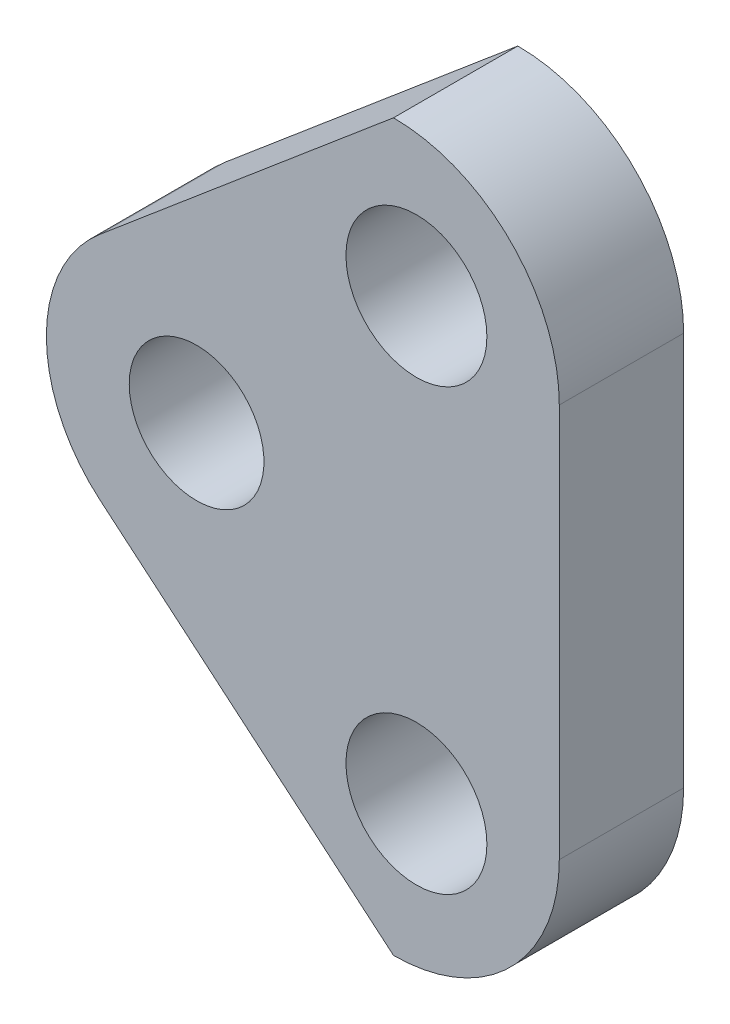
ISO-10303-21;
HEADER;
FILE_DESCRIPTION(('STEP AP214'),'2;1');
FILE_NAME('part.step','',(''),(''),'','','');
FILE_SCHEMA(('AUTOMOTIVE_DESIGN { 1 0 10303 214 1 1 1 1 }'));
ENDSEC;
DATA;
#1=APPLICATION_CONTEXT('core data for automotive mechanical design processes');
#2=APPLICATION_PROTOCOL_DEFINITION('international standard','automotive_design',2000,#1);
#3=PRODUCT_CONTEXT('',#1,'mechanical');
#4=PRODUCT('Part','Part','',(#3));
#5=PRODUCT_RELATED_PRODUCT_CATEGORY('part','',(#4));
#6=PRODUCT_DEFINITION_FORMATION('','',#4);
#7=PRODUCT_DEFINITION_CONTEXT('part definition',#1,'design');
#8=PRODUCT_DEFINITION('design','',#6,#7);
#9=PRODUCT_DEFINITION_SHAPE('','',#8);
#10=(LENGTH_UNIT() NAMED_UNIT(*) SI_UNIT(.MILLI.,.METRE.));
#11=(NAMED_UNIT(*) PLANE_ANGLE_UNIT() SI_UNIT($,.RADIAN.));
#12=(NAMED_UNIT(*) SI_UNIT($,.STERADIAN.) SOLID_ANGLE_UNIT());
#13=UNCERTAINTY_MEASURE_WITH_UNIT(LENGTH_MEASURE(1.E-05),#10,'distance_accuracy_value','');
#14=(GEOMETRIC_REPRESENTATION_CONTEXT(3) GLOBAL_UNCERTAINTY_ASSIGNED_CONTEXT((#13)) GLOBAL_UNIT_ASSIGNED_CONTEXT((#10,
#11,#12)) REPRESENTATION_CONTEXT('',''));
#15=CARTESIAN_POINT('',(0.,0.,0.));
#16=DIRECTION('',(0.,0.,1.));
#17=DIRECTION('',(1.,0.,0.));
#18=AXIS2_PLACEMENT_3D('',#15,#16,#17);
#19=CARTESIAN_POINT('',(0.,0.,0.));
#20=DIRECTION('',(0.,0.,1.));
#21=DIRECTION('',(1.,0.,0.));
#22=AXIS2_PLACEMENT_3D('',#19,#20,#21);
#23=PLANE('',#22);
#24=CARTESIAN_POINT('',(10.6066017177982,10.6066017177982,0.));
#25=DIRECTION('',(0.,0.,-1.));
#26=DIRECTION('',(-1.,0.,0.));
#27=AXIS2_PLACEMENT_3D('',#24,#25,#26);
#28=CIRCLE('',#27,3.4);
#29=CARTESIAN_POINT('',(7.20660171779821,10.6066017177982,0.));
#30=VERTEX_POINT('',#29);
#31=EDGE_CURVE('E151',#30,#30,#28,.T.);
#32=ORIENTED_EDGE('',*,*,#31,.F.);
#33=EDGE_LOOP('',(#32));
#34=FACE_BOUND('',#33,.T.);
#35=CARTESIAN_POINT('',(10.6066017177982,-10.6066017177982,0.));
#36=DIRECTION('',(0.,0.,-1.));
#37=DIRECTION('',(-1.,0.,0.));
#38=AXIS2_PLACEMENT_3D('',#35,#36,#37);
#39=CIRCLE('',#38,3.4);
#40=CARTESIAN_POINT('',(7.20660171779821,-10.6066017177982,0.));
#41=VERTEX_POINT('',#40);
#42=EDGE_CURVE('E191',#41,#41,#39,.T.);
#43=ORIENTED_EDGE('',*,*,#42,.F.);
#44=EDGE_LOOP('',(#43));
#45=FACE_BOUND('',#44,.T.);
#46=DIRECTION('',(0.764288364597995,-0.644874635677449,0.));
#47=VECTOR('',#46,1.);
#48=CARTESIAN_POINT('',(-4.67452685224013,-5.54012560815774,0.));
#49=LINE('',#48,#47);
#50=CARTESIAN_POINT('',(-4.67452685224013,-5.54012560815774,0.));
#51=VERTEX_POINT('',#50);
#52=CARTESIAN_POINT('',(9.5,-17.5,0.));
#53=VERTEX_POINT('',#52);
#54=EDGE_CURVE('E129',#51,#53,#49,.T.);
#55=ORIENTED_EDGE('',*,*,#54,.F.);
#56=CARTESIAN_POINT('',(0.,0.,0.));
#57=DIRECTION('',(0.,0.,1.));
#58=DIRECTION('',(1.,0.,0.));
#59=AXIS2_PLACEMENT_3D('',#56,#57,#58);
#60=CIRCLE('',#59,7.24873734152916);
#61=CARTESIAN_POINT('',(-4.67452685224013,5.54012560815774,0.));
#62=VERTEX_POINT('',#61);
#63=EDGE_CURVE('E189',#62,#51,#60,.T.);
#64=ORIENTED_EDGE('',*,*,#63,.F.);
#65=DIRECTION('',(-0.764288364597995,-0.644874635677448,0.));
#66=VECTOR('',#65,1.);
#67=CARTESIAN_POINT('',(-4.67452685224013,5.54012560815774,0.));
#68=LINE('',#67,#66);
#69=CARTESIAN_POINT('',(9.5,17.5,0.));
#70=VERTEX_POINT('',#69);
#71=EDGE_CURVE('E176',#70,#62,#68,.T.);
#72=ORIENTED_EDGE('',*,*,#71,.F.);
#73=CARTESIAN_POINT('',(9.5,9.5,0.));
#74=DIRECTION('',(0.,0.,1.));
#75=DIRECTION('',(1.,0.,0.));
#76=AXIS2_PLACEMENT_3D('',#73,#74,#75);
#77=CIRCLE('',#76,8.);
#78=CARTESIAN_POINT('',(17.5,9.5,0.));
#79=VERTEX_POINT('',#78);
#80=EDGE_CURVE('E165',#79,#70,#77,.T.);
#81=ORIENTED_EDGE('',*,*,#80,.F.);
#82=DIRECTION('',(0.,1.,0.));
#83=VECTOR('',#82,1.);
#84=CARTESIAN_POINT('',(17.5,0.,0.));
#85=LINE('',#84,#83);
#86=CARTESIAN_POINT('',(17.5,-9.50000000000001,0.));
#87=VERTEX_POINT('',#86);
#88=EDGE_CURVE('E162',#87,#79,#85,.T.);
#89=ORIENTED_EDGE('',*,*,#88,.F.);
#90=CARTESIAN_POINT('',(9.5,-9.50000000000001,0.));
#91=DIRECTION('',(0.,0.,1.));
#92=DIRECTION('',(1.,0.,0.));
#93=AXIS2_PLACEMENT_3D('',#90,#91,#92);
#94=CIRCLE('',#93,8.);
#95=EDGE_CURVE('E160',#53,#87,#94,.T.);
#96=ORIENTED_EDGE('',*,*,#95,.F.);
#97=EDGE_LOOP('',(#55,#64,#72,#81,#89,#96));
#98=FACE_BOUND('',#97,.T.);
#99=CARTESIAN_POINT('',(0.,0.,0.));
#100=DIRECTION('',(0.,0.,-1.));
#101=DIRECTION('',(-1.,0.,0.));
#102=AXIS2_PLACEMENT_3D('',#99,#100,#101);
#103=CIRCLE('',#102,3.25);
#104=CARTESIAN_POINT('',(-3.25,0.,0.));
#105=VERTEX_POINT('',#104);
#106=EDGE_CURVE('E353',#105,#105,#103,.T.);
#107=ORIENTED_EDGE('',*,*,#106,.F.);
#108=EDGE_LOOP('',(#107));
#109=FACE_BOUND('',#108,.T.);
#110=ADVANCED_FACE('F69',(#34,#45,#98,#109),#23,.F.);
#111=CARTESIAN_POINT('',(9.5,9.5,6.));
#112=DIRECTION('',(0.,0.,1.));
#113=DIRECTION('',(1.,0.,0.));
#114=AXIS2_PLACEMENT_3D('',#111,#112,#113);
#115=PLANE('',#114);
#116=CARTESIAN_POINT('',(10.6066017177982,10.6066017177982,6.));
#117=DIRECTION('',(0.,0.,1.));
#118=DIRECTION('',(1.,0.,0.));
#119=AXIS2_PLACEMENT_3D('',#116,#117,#118);
#120=CIRCLE('',#119,3.4);
#121=CARTESIAN_POINT('',(14.0066017177982,10.6066017177982,6.));
#122=VERTEX_POINT('',#121);
#123=EDGE_CURVE('E157',#122,#122,#120,.T.);
#124=ORIENTED_EDGE('',*,*,#123,.F.);
#125=EDGE_LOOP('',(#124));
#126=FACE_BOUND('',#125,.T.);
#127=CARTESIAN_POINT('',(10.6066017177982,-10.6066017177982,6.));
#128=DIRECTION('',(0.,0.,1.));
#129=DIRECTION('',(1.,0.,0.));
#130=AXIS2_PLACEMENT_3D('',#127,#128,#129);
#131=CIRCLE('',#130,3.4);
#132=CARTESIAN_POINT('',(14.0066017177982,-10.6066017177982,6.));
#133=VERTEX_POINT('',#132);
#134=EDGE_CURVE('E148',#133,#133,#131,.T.);
#135=ORIENTED_EDGE('',*,*,#134,.F.);
#136=EDGE_LOOP('',(#135));
#137=FACE_BOUND('',#136,.T.);
#138=CARTESIAN_POINT('',(0.,0.,6.));
#139=DIRECTION('',(0.,0.,1.));
#140=DIRECTION('',(1.,0.,0.));
#141=AXIS2_PLACEMENT_3D('',#138,#139,#140);
#142=CIRCLE('',#141,7.24873734152916);
#143=CARTESIAN_POINT('',(-4.67452685224013,5.54012560815774,6.));
#144=VERTEX_POINT('',#143);
#145=CARTESIAN_POINT('',(-4.67452685224013,-5.54012560815774,6.));
#146=VERTEX_POINT('',#145);
#147=EDGE_CURVE('E84',#144,#146,#142,.T.);
#148=ORIENTED_EDGE('',*,*,#147,.T.);
#149=DIRECTION('',(0.764288364597995,-0.644874635677449,0.));
#150=VECTOR('',#149,1.);
#151=CARTESIAN_POINT('',(-4.67452685224013,-5.54012560815774,6.));
#152=LINE('',#151,#150);
#153=CARTESIAN_POINT('',(9.5,-17.5,6.));
#154=VERTEX_POINT('',#153);
#155=EDGE_CURVE('E127',#146,#154,#152,.T.);
#156=ORIENTED_EDGE('',*,*,#155,.T.);
#157=CARTESIAN_POINT('',(9.5,-9.50000000000001,6.));
#158=DIRECTION('',(0.,0.,1.));
#159=DIRECTION('',(1.,0.,0.));
#160=AXIS2_PLACEMENT_3D('',#157,#158,#159);
#161=CIRCLE('',#160,8.);
#162=CARTESIAN_POINT('',(17.5,-9.50000000000001,6.));
#163=VERTEX_POINT('',#162);
#164=EDGE_CURVE('E137',#154,#163,#161,.T.);
#165=ORIENTED_EDGE('',*,*,#164,.T.);
#166=DIRECTION('',(0.,1.,0.));
#167=VECTOR('',#166,1.);
#168=CARTESIAN_POINT('',(17.5,-9.50000000000001,6.));
#169=LINE('',#168,#167);
#170=CARTESIAN_POINT('',(17.5,9.5,6.));
#171=VERTEX_POINT('',#170);
#172=EDGE_CURVE('E145',#163,#171,#169,.T.);
#173=ORIENTED_EDGE('',*,*,#172,.T.);
#174=CARTESIAN_POINT('',(9.5,9.5,6.));
#175=DIRECTION('',(0.,0.,1.));
#176=DIRECTION('',(1.,0.,0.));
#177=AXIS2_PLACEMENT_3D('',#174,#175,#176);
#178=CIRCLE('',#177,8.);
#179=CARTESIAN_POINT('',(9.5,17.5,6.));
#180=VERTEX_POINT('',#179);
#181=EDGE_CURVE('E146',#171,#180,#178,.T.);
#182=ORIENTED_EDGE('',*,*,#181,.T.);
#183=DIRECTION('',(-0.764288364597995,-0.644874635677448,0.));
#184=VECTOR('',#183,1.);
#185=CARTESIAN_POINT('',(-4.67452685224013,5.54012560815774,6.));
#186=LINE('',#185,#184);
#187=EDGE_CURVE('E181',#180,#144,#186,.T.);
#188=ORIENTED_EDGE('',*,*,#187,.T.);
#189=EDGE_LOOP('',(#148,#156,#165,#173,#182,#188));
#190=FACE_BOUND('',#189,.T.);
#191=CARTESIAN_POINT('',(0.,0.,6.));
#192=DIRECTION('',(0.,0.,-1.));
#193=DIRECTION('',(-1.,0.,0.));
#194=AXIS2_PLACEMENT_3D('',#191,#192,#193);
#195=CIRCLE('',#194,3.25);
#196=CARTESIAN_POINT('',(-3.25,0.,6.));
#197=VERTEX_POINT('',#196);
#198=EDGE_CURVE('E141',#197,#197,#195,.T.);
#199=ORIENTED_EDGE('',*,*,#198,.T.);
#200=EDGE_LOOP('',(#199));
#201=FACE_BOUND('',#200,.T.);
#202=ADVANCED_FACE('F135',(#126,#137,#190,#201),#115,.T.);
#203=CARTESIAN_POINT('',(9.5,-9.50000000000001,11.));
#204=DIRECTION('',(0.,0.,-1.));
#205=DIRECTION('',(-1.,0.,0.));
#206=AXIS2_PLACEMENT_3D('',#203,#204,#205);
#207=CYLINDRICAL_SURFACE('',#206,8.);
#208=ORIENTED_EDGE('',*,*,#164,.F.);
#209=DIRECTION('',(0.,0.,-1.));
#210=VECTOR('',#209,1.);
#211=CARTESIAN_POINT('',(9.5,-17.5,11.));
#212=LINE('',#211,#210);
#213=EDGE_CURVE('E12',#154,#53,#212,.T.);
#214=ORIENTED_EDGE('',*,*,#213,.T.);
#215=ORIENTED_EDGE('',*,*,#95,.T.);
#216=DIRECTION('',(0.,0.,-1.));
#217=VECTOR('',#216,1.);
#218=CARTESIAN_POINT('',(17.5,-9.50000000000001,11.));
#219=LINE('',#218,#217);
#220=EDGE_CURVE('E77',#163,#87,#219,.T.);
#221=ORIENTED_EDGE('',*,*,#220,.F.);
#222=EDGE_LOOP('',(#208,#214,#215,#221));
#223=FACE_BOUND('',#222,.T.);
#224=ADVANCED_FACE('F144',(#223),#207,.T.);
#225=CARTESIAN_POINT('',(17.5,0.,11.));
#226=DIRECTION('',(-1.,0.,0.));
#227=DIRECTION('',(0.,0.,1.));
#228=AXIS2_PLACEMENT_3D('',#225,#226,#227);
#229=PLANE('',#228);
#230=ORIENTED_EDGE('',*,*,#172,.F.);
#231=ORIENTED_EDGE('',*,*,#220,.T.);
#232=ORIENTED_EDGE('',*,*,#88,.T.);
#233=DIRECTION('',(0.,0.,-1.));
#234=VECTOR('',#233,1.);
#235=CARTESIAN_POINT('',(17.5,9.5,11.));
#236=LINE('',#235,#234);
#237=EDGE_CURVE('E92',#171,#79,#236,.T.);
#238=ORIENTED_EDGE('',*,*,#237,.F.);
#239=EDGE_LOOP('',(#230,#231,#232,#238));
#240=FACE_BOUND('',#239,.T.);
#241=ADVANCED_FACE('F171',(#240),#229,.F.);
#242=CARTESIAN_POINT('',(9.5,9.5,11.));
#243=DIRECTION('',(0.,0.,-1.));
#244=DIRECTION('',(-1.,0.,0.));
#245=AXIS2_PLACEMENT_3D('',#242,#243,#244);
#246=CYLINDRICAL_SURFACE('',#245,8.);
#247=ORIENTED_EDGE('',*,*,#181,.F.);
#248=ORIENTED_EDGE('',*,*,#237,.T.);
#249=ORIENTED_EDGE('',*,*,#80,.T.);
#250=DIRECTION('',(0.,0.,-1.));
#251=VECTOR('',#250,1.);
#252=CARTESIAN_POINT('',(9.5,17.5,11.));
#253=LINE('',#252,#251);
#254=EDGE_CURVE('E167',#180,#70,#253,.T.);
#255=ORIENTED_EDGE('',*,*,#254,.F.);
#256=EDGE_LOOP('',(#247,#248,#249,#255));
#257=FACE_BOUND('',#256,.T.);
#258=ADVANCED_FACE('F178',(#257),#246,.T.);
#259=CARTESIAN_POINT('',(10.6066017177982,-10.6066017177982,11.));
#260=DIRECTION('',(0.,0.,-1.));
#261=DIRECTION('',(-1.,0.,0.));
#262=AXIS2_PLACEMENT_3D('',#259,#260,#261);
#263=CYLINDRICAL_SURFACE('',#262,3.4);
#264=ORIENTED_EDGE('',*,*,#134,.T.);
#265=EDGE_LOOP('',(#264));
#266=FACE_BOUND('',#265,.T.);
#267=ORIENTED_EDGE('',*,*,#42,.T.);
#268=EDGE_LOOP('',(#267));
#269=FACE_BOUND('',#268,.T.);
#270=ADVANCED_FACE('F71',(#266,#269),#263,.F.);
#271=CARTESIAN_POINT('',(10.6066017177982,10.6066017177982,11.));
#272=DIRECTION('',(0.,0.,-1.));
#273=DIRECTION('',(-1.,0.,0.));
#274=AXIS2_PLACEMENT_3D('',#271,#272,#273);
#275=CYLINDRICAL_SURFACE('',#274,3.4);
#276=ORIENTED_EDGE('',*,*,#123,.T.);
#277=EDGE_LOOP('',(#276));
#278=FACE_BOUND('',#277,.T.);
#279=ORIENTED_EDGE('',*,*,#31,.T.);
#280=EDGE_LOOP('',(#279));
#281=FACE_BOUND('',#280,.T.);
#282=ADVANCED_FACE('F213',(#278,#281),#275,.F.);
#283=CARTESIAN_POINT('',(0.,0.,-4.));
#284=DIRECTION('',(0.,0.,1.));
#285=DIRECTION('',(1.,0.,0.));
#286=AXIS2_PLACEMENT_3D('',#283,#284,#285);
#287=CYLINDRICAL_SURFACE('',#286,7.24873734152916);
#288=ORIENTED_EDGE('',*,*,#63,.T.);
#289=DIRECTION('',(0.,0.,1.));
#290=VECTOR('',#289,1.);
#291=CARTESIAN_POINT('',(-4.67452685224013,-5.54012560815774,-4.));
#292=LINE('',#291,#290);
#293=EDGE_CURVE('E140',#51,#146,#292,.T.);
#294=ORIENTED_EDGE('',*,*,#293,.T.);
#295=ORIENTED_EDGE('',*,*,#147,.F.);
#296=DIRECTION('',(0.,0.,1.));
#297=VECTOR('',#296,1.);
#298=CARTESIAN_POINT('',(-4.67452685224013,5.54012560815774,-4.));
#299=LINE('',#298,#297);
#300=EDGE_CURVE('E182',#62,#144,#299,.T.);
#301=ORIENTED_EDGE('',*,*,#300,.F.);
#302=EDGE_LOOP('',(#288,#294,#295,#301));
#303=FACE_BOUND('',#302,.T.);
#304=ADVANCED_FACE('F215',(#303),#287,.T.);
#305=CARTESIAN_POINT('',(-4.67452685224013,5.54012560815774,-4.));
#306=DIRECTION('',(-0.644874635677448,0.764288364597995,0.));
#307=DIRECTION('',(-0.764288364597995,-0.644874635677448,0.));
#308=AXIS2_PLACEMENT_3D('',#305,#306,#307);
#309=PLANE('',#308);
#310=ORIENTED_EDGE('',*,*,#71,.T.);
#311=ORIENTED_EDGE('',*,*,#300,.T.);
#312=ORIENTED_EDGE('',*,*,#187,.F.);
#313=ORIENTED_EDGE('',*,*,#254,.T.);
#314=EDGE_LOOP('',(#310,#311,#312,#313));
#315=FACE_BOUND('',#314,.T.);
#316=ADVANCED_FACE('F180',(#315),#309,.T.);
#317=CARTESIAN_POINT('',(-4.67452685224013,-5.54012560815774,-4.));
#318=DIRECTION('',(-0.644874635677449,-0.764288364597995,0.));
#319=DIRECTION('',(0.764288364597995,-0.644874635677449,0.));
#320=AXIS2_PLACEMENT_3D('',#317,#318,#319);
#321=PLANE('',#320);
#322=ORIENTED_EDGE('',*,*,#54,.T.);
#323=ORIENTED_EDGE('',*,*,#213,.F.);
#324=ORIENTED_EDGE('',*,*,#155,.F.);
#325=ORIENTED_EDGE('',*,*,#293,.F.);
#326=EDGE_LOOP('',(#322,#323,#324,#325));
#327=FACE_BOUND('',#326,.T.);
#328=ADVANCED_FACE('F125',(#327),#321,.T.);
#329=CARTESIAN_POINT('',(0.,0.,6.));
#330=DIRECTION('',(0.,0.,-1.));
#331=DIRECTION('',(-1.,0.,0.));
#332=AXIS2_PLACEMENT_3D('',#329,#330,#331);
#333=CYLINDRICAL_SURFACE('',#332,3.25);
#334=ORIENTED_EDGE('',*,*,#198,.F.);
#335=EDGE_LOOP('',(#334));
#336=FACE_BOUND('',#335,.T.);
#337=ORIENTED_EDGE('',*,*,#106,.T.);
#338=EDGE_LOOP('',(#337));
#339=FACE_BOUND('',#338,.T.);
#340=ADVANCED_FACE('F255',(#336,#339),#333,.F.);
#341=CLOSED_SHELL('',(#110,#202,#224,#241,#258,#270,#282,#304,#316,#328,#340));
#342=MANIFOLD_SOLID_BREP('B2',#341);
#343=ADVANCED_BREP_SHAPE_REPRESENTATION('',(#18,#342),#14);
#344=SHAPE_DEFINITION_REPRESENTATION(#9,#343);
ENDSEC;
END-ISO-10303-21;
